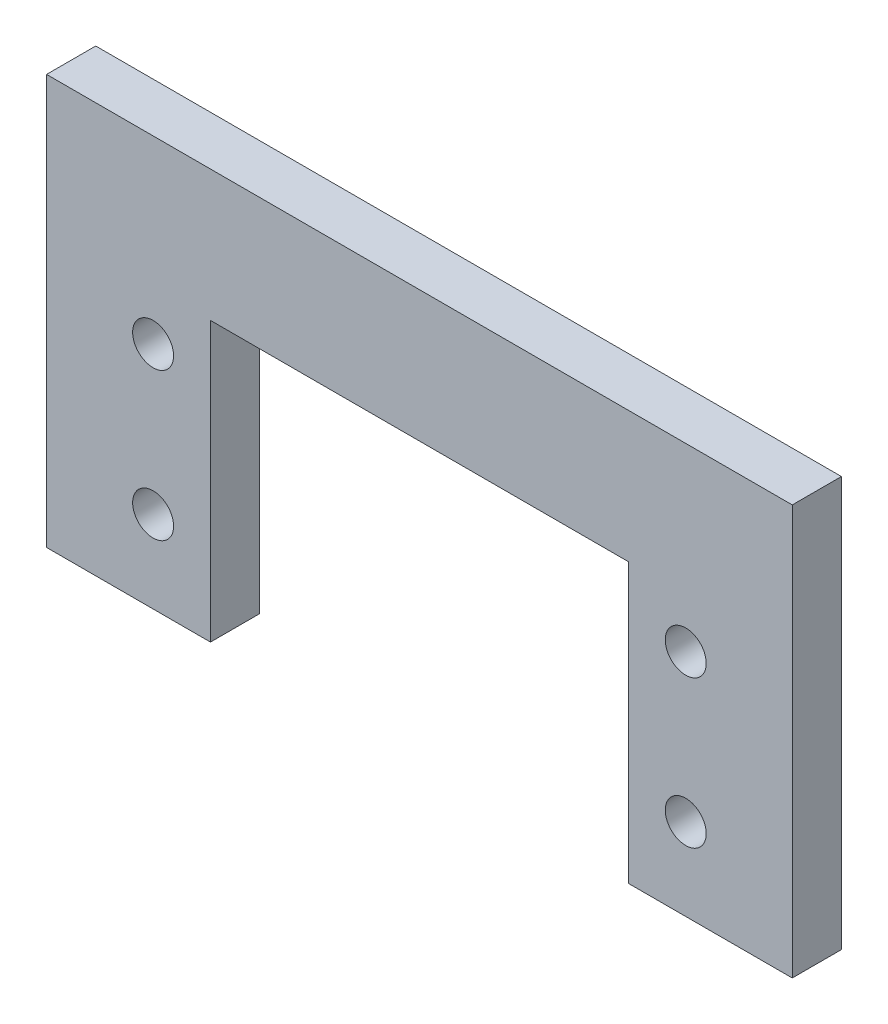
ISO-10303-21;
HEADER;
FILE_DESCRIPTION(('STEP AP214'),'2;1');
FILE_NAME('part.step','',(''),(''),'','','');
FILE_SCHEMA(('AUTOMOTIVE_DESIGN { 1 0 10303 214 1 1 1 1 }'));
ENDSEC;
DATA;
#1=APPLICATION_CONTEXT('core data for automotive mechanical design processes');
#2=APPLICATION_PROTOCOL_DEFINITION('international standard','automotive_design',2000,#1);
#3=PRODUCT_CONTEXT('',#1,'mechanical');
#4=PRODUCT('Part','Part','',(#3));
#5=PRODUCT_RELATED_PRODUCT_CATEGORY('part','',(#4));
#6=PRODUCT_DEFINITION_FORMATION('','',#4);
#7=PRODUCT_DEFINITION_CONTEXT('part definition',#1,'design');
#8=PRODUCT_DEFINITION('design','',#6,#7);
#9=PRODUCT_DEFINITION_SHAPE('','',#8);
#10=(LENGTH_UNIT() NAMED_UNIT(*) SI_UNIT(.MILLI.,.METRE.));
#11=(NAMED_UNIT(*) PLANE_ANGLE_UNIT() SI_UNIT($,.RADIAN.));
#12=(NAMED_UNIT(*) SI_UNIT($,.STERADIAN.) SOLID_ANGLE_UNIT());
#13=UNCERTAINTY_MEASURE_WITH_UNIT(LENGTH_MEASURE(1.E-05),#10,'distance_accuracy_value','');
#14=(GEOMETRIC_REPRESENTATION_CONTEXT(3) GLOBAL_UNCERTAINTY_ASSIGNED_CONTEXT((#13)) GLOBAL_UNIT_ASSIGNED_CONTEXT((#10,
#11,#12)) REPRESENTATION_CONTEXT('',''));
#15=CARTESIAN_POINT('',(0.,0.,0.));
#16=DIRECTION('',(0.,0.,1.));
#17=DIRECTION('',(1.,0.,0.));
#18=AXIS2_PLACEMENT_3D('',#15,#16,#17);
#19=CARTESIAN_POINT('',(0.,0.,3.));
#20=DIRECTION('',(0.,0.,1.));
#21=DIRECTION('',(1.,0.,0.));
#22=AXIS2_PLACEMENT_3D('',#19,#20,#21);
#23=PLANE('',#22);
#24=CARTESIAN_POINT('',(-16.25,-2.,3.));
#25=DIRECTION('',(0.,0.,1.));
#26=DIRECTION('',(1.,0.,0.));
#27=AXIS2_PLACEMENT_3D('',#24,#25,#26);
#28=CIRCLE('',#27,1.25);
#29=CARTESIAN_POINT('',(-15.,-2.,3.));
#30=VERTEX_POINT('',#29);
#31=EDGE_CURVE('E192',#30,#30,#28,.T.);
#32=ORIENTED_EDGE('',*,*,#31,.F.);
#33=EDGE_LOOP('',(#32));
#34=FACE_BOUND('',#33,.T.);
#35=CARTESIAN_POINT('',(-16.25,-11.,3.));
#36=DIRECTION('',(0.,0.,1.));
#37=DIRECTION('',(1.,0.,0.));
#38=AXIS2_PLACEMENT_3D('',#35,#36,#37);
#39=CIRCLE('',#38,1.25);
#40=CARTESIAN_POINT('',(-15.,-11.,3.));
#41=VERTEX_POINT('',#40);
#42=EDGE_CURVE('E142',#41,#41,#39,.T.);
#43=ORIENTED_EDGE('',*,*,#42,.F.);
#44=EDGE_LOOP('',(#43));
#45=FACE_BOUND('',#44,.T.);
#46=DIRECTION('',(0.,-1.,0.));
#47=VECTOR('',#46,1.);
#48=CARTESIAN_POINT('',(-22.75,9.,3.));
#49=LINE('',#48,#47);
#50=CARTESIAN_POINT('',(-22.75,9.,3.));
#51=VERTEX_POINT('',#50);
#52=CARTESIAN_POINT('',(-22.75,-16.,3.));
#53=VERTEX_POINT('',#52);
#54=EDGE_CURVE('E158',#51,#53,#49,.T.);
#55=ORIENTED_EDGE('',*,*,#54,.T.);
#56=DIRECTION('',(1.,0.,0.));
#57=VECTOR('',#56,1.);
#58=CARTESIAN_POINT('',(-22.75,-16.,3.));
#59=LINE('',#58,#57);
#60=CARTESIAN_POINT('',(-12.75,-16.,3.));
#61=VERTEX_POINT('',#60);
#62=EDGE_CURVE('E100',#53,#61,#59,.T.);
#63=ORIENTED_EDGE('',*,*,#62,.T.);
#64=DIRECTION('',(0.,-1.,0.));
#65=VECTOR('',#64,1.);
#66=CARTESIAN_POINT('',(-12.75,0.999999999999997,3.));
#67=LINE('',#66,#65);
#68=CARTESIAN_POINT('',(-12.75,0.999999999999997,3.));
#69=VERTEX_POINT('',#68);
#70=EDGE_CURVE('E170',#69,#61,#67,.T.);
#71=ORIENTED_EDGE('',*,*,#70,.F.);
#72=DIRECTION('',(-1.,0.,0.));
#73=VECTOR('',#72,1.);
#74=CARTESIAN_POINT('',(12.75,0.999999999999997,3.));
#75=LINE('',#74,#73);
#76=CARTESIAN_POINT('',(12.75,0.999999999999997,3.));
#77=VERTEX_POINT('',#76);
#78=EDGE_CURVE('E180',#77,#69,#75,.T.);
#79=ORIENTED_EDGE('',*,*,#78,.F.);
#80=DIRECTION('',(0.,-1.,0.));
#81=VECTOR('',#80,1.);
#82=CARTESIAN_POINT('',(12.75,0.999999999999997,3.));
#83=LINE('',#82,#81);
#84=CARTESIAN_POINT('',(12.75,-16.,3.));
#85=VERTEX_POINT('',#84);
#86=EDGE_CURVE('E131',#77,#85,#83,.T.);
#87=ORIENTED_EDGE('',*,*,#86,.T.);
#88=DIRECTION('',(-1.,0.,0.));
#89=VECTOR('',#88,1.);
#90=CARTESIAN_POINT('',(22.75,-16.,3.));
#91=LINE('',#90,#89);
#92=CARTESIAN_POINT('',(22.75,-16.,3.));
#93=VERTEX_POINT('',#92);
#94=EDGE_CURVE('E118',#93,#85,#91,.T.);
#95=ORIENTED_EDGE('',*,*,#94,.F.);
#96=DIRECTION('',(0.,-1.,0.));
#97=VECTOR('',#96,1.);
#98=CARTESIAN_POINT('',(22.75,9.,3.));
#99=LINE('',#98,#97);
#100=CARTESIAN_POINT('',(22.75,9.,3.));
#101=VERTEX_POINT('',#100);
#102=EDGE_CURVE('E128',#101,#93,#99,.T.);
#103=ORIENTED_EDGE('',*,*,#102,.F.);
#104=DIRECTION('',(-1.,0.,0.));
#105=VECTOR('',#104,1.);
#106=CARTESIAN_POINT('',(22.75,9.,3.));
#107=LINE('',#106,#105);
#108=EDGE_CURVE('E56',#101,#51,#107,.T.);
#109=ORIENTED_EDGE('',*,*,#108,.T.);
#110=EDGE_LOOP('',(#55,#63,#71,#79,#87,#95,#103,#109));
#111=FACE_BOUND('',#110,.T.);
#112=CARTESIAN_POINT('',(16.25,-2.,3.));
#113=DIRECTION('',(0.,0.,1.));
#114=DIRECTION('',(1.,0.,0.));
#115=AXIS2_PLACEMENT_3D('',#112,#113,#114);
#116=CIRCLE('',#115,1.25);
#117=CARTESIAN_POINT('',(17.5,-2.,3.));
#118=VERTEX_POINT('',#117);
#119=EDGE_CURVE('E204',#118,#118,#116,.F.);
#120=ORIENTED_EDGE('',*,*,#119,.T.);
#121=EDGE_LOOP('',(#120));
#122=FACE_BOUND('',#121,.T.);
#123=CARTESIAN_POINT('',(16.25,-11.,3.));
#124=DIRECTION('',(0.,0.,1.));
#125=DIRECTION('',(1.,0.,0.));
#126=AXIS2_PLACEMENT_3D('',#123,#124,#125);
#127=CIRCLE('',#126,1.25);
#128=CARTESIAN_POINT('',(17.5,-11.,3.));
#129=VERTEX_POINT('',#128);
#130=EDGE_CURVE('E198',#129,#129,#127,.F.);
#131=ORIENTED_EDGE('',*,*,#130,.T.);
#132=EDGE_LOOP('',(#131));
#133=FACE_BOUND('',#132,.T.);
#134=ADVANCED_FACE('F39',(#34,#45,#111,#122,#133),#23,.T.);
#135=CARTESIAN_POINT('',(0.,0.,0.));
#136=DIRECTION('',(0.,0.,1.));
#137=DIRECTION('',(1.,0.,0.));
#138=AXIS2_PLACEMENT_3D('',#135,#136,#137);
#139=PLANE('',#138);
#140=CARTESIAN_POINT('',(-16.25,-2.,0.));
#141=DIRECTION('',(0.,0.,1.));
#142=DIRECTION('',(1.,0.,0.));
#143=AXIS2_PLACEMENT_3D('',#140,#141,#142);
#144=CIRCLE('',#143,1.25);
#145=CARTESIAN_POINT('',(-15.,-2.,0.));
#146=VERTEX_POINT('',#145);
#147=EDGE_CURVE('E195',#146,#146,#144,.T.);
#148=ORIENTED_EDGE('',*,*,#147,.T.);
#149=EDGE_LOOP('',(#148));
#150=FACE_BOUND('',#149,.T.);
#151=CARTESIAN_POINT('',(16.25,-2.,0.));
#152=DIRECTION('',(0.,0.,1.));
#153=DIRECTION('',(1.,0.,0.));
#154=AXIS2_PLACEMENT_3D('',#151,#152,#153);
#155=CIRCLE('',#154,1.25);
#156=CARTESIAN_POINT('',(17.5,-2.,0.));
#157=VERTEX_POINT('',#156);
#158=EDGE_CURVE('E189',#157,#157,#155,.F.);
#159=ORIENTED_EDGE('',*,*,#158,.F.);
#160=EDGE_LOOP('',(#159));
#161=FACE_BOUND('',#160,.T.);
#162=CARTESIAN_POINT('',(-16.25,-11.,0.));
#163=DIRECTION('',(0.,0.,1.));
#164=DIRECTION('',(1.,0.,0.));
#165=AXIS2_PLACEMENT_3D('',#162,#163,#164);
#166=CIRCLE('',#165,1.25);
#167=CARTESIAN_POINT('',(-15.,-11.,0.));
#168=VERTEX_POINT('',#167);
#169=EDGE_CURVE('E186',#168,#168,#166,.T.);
#170=ORIENTED_EDGE('',*,*,#169,.T.);
#171=EDGE_LOOP('',(#170));
#172=FACE_BOUND('',#171,.T.);
#173=DIRECTION('',(0.,-1.,0.));
#174=VECTOR('',#173,1.);
#175=CARTESIAN_POINT('',(-22.75,9.,0.));
#176=LINE('',#175,#174);
#177=CARTESIAN_POINT('',(-22.75,9.,0.));
#178=VERTEX_POINT('',#177);
#179=CARTESIAN_POINT('',(-22.75,-16.,0.));
#180=VERTEX_POINT('',#179);
#181=EDGE_CURVE('E139',#178,#180,#176,.T.);
#182=ORIENTED_EDGE('',*,*,#181,.F.);
#183=DIRECTION('',(1.,0.,0.));
#184=VECTOR('',#183,1.);
#185=CARTESIAN_POINT('',(-22.75,9.,0.));
#186=LINE('',#185,#184);
#187=CARTESIAN_POINT('',(22.75,9.,0.));
#188=VERTEX_POINT('',#187);
#189=EDGE_CURVE('E86',#178,#188,#186,.T.);
#190=ORIENTED_EDGE('',*,*,#189,.T.);
#191=DIRECTION('',(0.,-1.,0.));
#192=VECTOR('',#191,1.);
#193=CARTESIAN_POINT('',(22.75,9.,0.));
#194=LINE('',#193,#192);
#195=CARTESIAN_POINT('',(22.75,-16.,0.));
#196=VERTEX_POINT('',#195);
#197=EDGE_CURVE('E155',#188,#196,#194,.T.);
#198=ORIENTED_EDGE('',*,*,#197,.T.);
#199=DIRECTION('',(-1.,0.,0.));
#200=VECTOR('',#199,1.);
#201=CARTESIAN_POINT('',(22.75,-16.,0.));
#202=LINE('',#201,#200);
#203=CARTESIAN_POINT('',(12.75,-16.,0.));
#204=VERTEX_POINT('',#203);
#205=EDGE_CURVE('E120',#196,#204,#202,.T.);
#206=ORIENTED_EDGE('',*,*,#205,.T.);
#207=DIRECTION('',(0.,-1.,0.));
#208=VECTOR('',#207,1.);
#209=CARTESIAN_POINT('',(12.75,0.999999999999997,0.));
#210=LINE('',#209,#208);
#211=CARTESIAN_POINT('',(12.75,0.999999999999997,0.));
#212=VERTEX_POINT('',#211);
#213=EDGE_CURVE('E151',#212,#204,#210,.T.);
#214=ORIENTED_EDGE('',*,*,#213,.F.);
#215=DIRECTION('',(-1.,0.,0.));
#216=VECTOR('',#215,1.);
#217=CARTESIAN_POINT('',(12.75,0.999999999999997,0.));
#218=LINE('',#217,#216);
#219=CARTESIAN_POINT('',(-12.75,0.999999999999997,0.));
#220=VERTEX_POINT('',#219);
#221=EDGE_CURVE('E148',#212,#220,#218,.T.);
#222=ORIENTED_EDGE('',*,*,#221,.T.);
#223=DIRECTION('',(0.,-1.,0.));
#224=VECTOR('',#223,1.);
#225=CARTESIAN_POINT('',(-12.75,0.999999999999997,0.));
#226=LINE('',#225,#224);
#227=CARTESIAN_POINT('',(-12.75,-16.,0.));
#228=VERTEX_POINT('',#227);
#229=EDGE_CURVE('E145',#220,#228,#226,.T.);
#230=ORIENTED_EDGE('',*,*,#229,.T.);
#231=DIRECTION('',(1.,0.,0.));
#232=VECTOR('',#231,1.);
#233=CARTESIAN_POINT('',(-22.75,-16.,0.));
#234=LINE('',#233,#232);
#235=EDGE_CURVE('E141',#180,#228,#234,.T.);
#236=ORIENTED_EDGE('',*,*,#235,.F.);
#237=EDGE_LOOP('',(#182,#190,#198,#206,#214,#222,#230,#236));
#238=FACE_BOUND('',#237,.T.);
#239=CARTESIAN_POINT('',(16.25,-11.,0.));
#240=DIRECTION('',(0.,0.,1.));
#241=DIRECTION('',(1.,0.,0.));
#242=AXIS2_PLACEMENT_3D('',#239,#240,#241);
#243=CIRCLE('',#242,1.25);
#244=CARTESIAN_POINT('',(17.5,-11.,0.));
#245=VERTEX_POINT('',#244);
#246=EDGE_CURVE('E201',#245,#245,#243,.F.);
#247=ORIENTED_EDGE('',*,*,#246,.F.);
#248=EDGE_LOOP('',(#247));
#249=FACE_BOUND('',#248,.T.);
#250=ADVANCED_FACE('F173',(#150,#161,#172,#238,#249),#139,.F.);
#251=CARTESIAN_POINT('',(-22.75,9.,3.));
#252=DIRECTION('',(1.,0.,0.));
#253=DIRECTION('',(0.,1.,0.));
#254=AXIS2_PLACEMENT_3D('',#251,#252,#253);
#255=PLANE('',#254);
#256=ORIENTED_EDGE('',*,*,#181,.T.);
#257=DIRECTION('',(0.,0.,-1.));
#258=VECTOR('',#257,1.);
#259=CARTESIAN_POINT('',(-22.75,-16.,3.));
#260=LINE('',#259,#258);
#261=EDGE_CURVE('E11',#53,#180,#260,.T.);
#262=ORIENTED_EDGE('',*,*,#261,.F.);
#263=ORIENTED_EDGE('',*,*,#54,.F.);
#264=DIRECTION('',(0.,0.,-1.));
#265=VECTOR('',#264,1.);
#266=CARTESIAN_POINT('',(-22.75,9.,3.));
#267=LINE('',#266,#265);
#268=EDGE_CURVE('E93',#51,#178,#267,.T.);
#269=ORIENTED_EDGE('',*,*,#268,.T.);
#270=EDGE_LOOP('',(#256,#262,#263,#269));
#271=FACE_BOUND('',#270,.T.);
#272=ADVANCED_FACE('F41',(#271),#255,.F.);
#273=CARTESIAN_POINT('',(-22.75,-16.,3.));
#274=DIRECTION('',(0.,1.,0.));
#275=DIRECTION('',(0.,0.,1.));
#276=AXIS2_PLACEMENT_3D('',#273,#274,#275);
#277=PLANE('',#276);
#278=ORIENTED_EDGE('',*,*,#235,.T.);
#279=DIRECTION('',(0.,0.,-1.));
#280=VECTOR('',#279,1.);
#281=CARTESIAN_POINT('',(-12.75,-16.,3.));
#282=LINE('',#281,#280);
#283=EDGE_CURVE('E48',#61,#228,#282,.T.);
#284=ORIENTED_EDGE('',*,*,#283,.F.);
#285=ORIENTED_EDGE('',*,*,#62,.F.);
#286=ORIENTED_EDGE('',*,*,#261,.T.);
#287=EDGE_LOOP('',(#278,#284,#285,#286));
#288=FACE_BOUND('',#287,.T.);
#289=ADVANCED_FACE('F171',(#288),#277,.F.);
#290=CARTESIAN_POINT('',(-12.75,0.999999999999997,3.));
#291=DIRECTION('',(1.,0.,0.));
#292=DIRECTION('',(0.,1.,0.));
#293=AXIS2_PLACEMENT_3D('',#290,#291,#292);
#294=PLANE('',#293);
#295=ORIENTED_EDGE('',*,*,#229,.F.);
#296=DIRECTION('',(0.,0.,-1.));
#297=VECTOR('',#296,1.);
#298=CARTESIAN_POINT('',(-12.75,0.999999999999997,3.));
#299=LINE('',#298,#297);
#300=EDGE_CURVE('E164',#69,#220,#299,.T.);
#301=ORIENTED_EDGE('',*,*,#300,.F.);
#302=ORIENTED_EDGE('',*,*,#70,.T.);
#303=ORIENTED_EDGE('',*,*,#283,.T.);
#304=EDGE_LOOP('',(#295,#301,#302,#303));
#305=FACE_BOUND('',#304,.T.);
#306=ADVANCED_FACE('F168',(#305),#294,.T.);
#307=CARTESIAN_POINT('',(12.75,0.999999999999997,3.));
#308=DIRECTION('',(0.,-1.,0.));
#309=DIRECTION('',(0.,0.,-1.));
#310=AXIS2_PLACEMENT_3D('',#307,#308,#309);
#311=PLANE('',#310);
#312=ORIENTED_EDGE('',*,*,#221,.F.);
#313=DIRECTION('',(0.,0.,-1.));
#314=VECTOR('',#313,1.);
#315=CARTESIAN_POINT('',(12.75,0.999999999999997,3.));
#316=LINE('',#315,#314);
#317=EDGE_CURVE('E162',#77,#212,#316,.T.);
#318=ORIENTED_EDGE('',*,*,#317,.F.);
#319=ORIENTED_EDGE('',*,*,#78,.T.);
#320=ORIENTED_EDGE('',*,*,#300,.T.);
#321=EDGE_LOOP('',(#312,#318,#319,#320));
#322=FACE_BOUND('',#321,.T.);
#323=ADVANCED_FACE('F178',(#322),#311,.T.);
#324=CARTESIAN_POINT('',(12.75,0.999999999999997,3.));
#325=DIRECTION('',(1.,0.,0.));
#326=DIRECTION('',(0.,1.,0.));
#327=AXIS2_PLACEMENT_3D('',#324,#325,#326);
#328=PLANE('',#327);
#329=ORIENTED_EDGE('',*,*,#213,.T.);
#330=DIRECTION('',(0.,0.,-1.));
#331=VECTOR('',#330,1.);
#332=CARTESIAN_POINT('',(12.75,-16.,3.));
#333=LINE('',#332,#331);
#334=EDGE_CURVE('E124',#85,#204,#333,.T.);
#335=ORIENTED_EDGE('',*,*,#334,.F.);
#336=ORIENTED_EDGE('',*,*,#86,.F.);
#337=ORIENTED_EDGE('',*,*,#317,.T.);
#338=EDGE_LOOP('',(#329,#335,#336,#337));
#339=FACE_BOUND('',#338,.T.);
#340=ADVANCED_FACE('F245',(#339),#328,.F.);
#341=CARTESIAN_POINT('',(22.75,-16.,3.));
#342=DIRECTION('',(0.,-1.,0.));
#343=DIRECTION('',(0.,0.,-1.));
#344=AXIS2_PLACEMENT_3D('',#341,#342,#343);
#345=PLANE('',#344);
#346=ORIENTED_EDGE('',*,*,#205,.F.);
#347=DIRECTION('',(0.,0.,-1.));
#348=VECTOR('',#347,1.);
#349=CARTESIAN_POINT('',(22.75,-16.,3.));
#350=LINE('',#349,#348);
#351=EDGE_CURVE('E115',#93,#196,#350,.T.);
#352=ORIENTED_EDGE('',*,*,#351,.F.);
#353=ORIENTED_EDGE('',*,*,#94,.T.);
#354=ORIENTED_EDGE('',*,*,#334,.T.);
#355=EDGE_LOOP('',(#346,#352,#353,#354));
#356=FACE_BOUND('',#355,.T.);
#357=ADVANCED_FACE('F117',(#356),#345,.T.);
#358=CARTESIAN_POINT('',(22.75,9.,3.));
#359=DIRECTION('',(1.,0.,0.));
#360=DIRECTION('',(0.,1.,0.));
#361=AXIS2_PLACEMENT_3D('',#358,#359,#360);
#362=PLANE('',#361);
#363=ORIENTED_EDGE('',*,*,#197,.F.);
#364=DIRECTION('',(0.,0.,-1.));
#365=VECTOR('',#364,1.);
#366=CARTESIAN_POINT('',(22.75,9.,3.));
#367=LINE('',#366,#365);
#368=EDGE_CURVE('E125',#101,#188,#367,.T.);
#369=ORIENTED_EDGE('',*,*,#368,.F.);
#370=ORIENTED_EDGE('',*,*,#102,.T.);
#371=ORIENTED_EDGE('',*,*,#351,.T.);
#372=EDGE_LOOP('',(#363,#369,#370,#371));
#373=FACE_BOUND('',#372,.T.);
#374=ADVANCED_FACE('F134',(#373),#362,.T.);
#375=CARTESIAN_POINT('',(-22.75,9.,3.));
#376=DIRECTION('',(0.,1.,0.));
#377=DIRECTION('',(-1.,0.,0.));
#378=AXIS2_PLACEMENT_3D('',#375,#376,#377);
#379=PLANE('',#378);
#380=ORIENTED_EDGE('',*,*,#189,.F.);
#381=ORIENTED_EDGE('',*,*,#268,.F.);
#382=ORIENTED_EDGE('',*,*,#108,.F.);
#383=ORIENTED_EDGE('',*,*,#368,.T.);
#384=EDGE_LOOP('',(#380,#381,#382,#383));
#385=FACE_BOUND('',#384,.T.);
#386=ADVANCED_FACE('F220',(#385),#379,.T.);
#387=CARTESIAN_POINT('',(-16.25,-11.,3.));
#388=DIRECTION('',(0.,0.,-1.));
#389=DIRECTION('',(-1.,0.,0.));
#390=AXIS2_PLACEMENT_3D('',#387,#388,#389);
#391=CYLINDRICAL_SURFACE('',#390,1.25);
#392=ORIENTED_EDGE('',*,*,#42,.T.);
#393=EDGE_LOOP('',(#392));
#394=FACE_BOUND('',#393,.T.);
#395=ORIENTED_EDGE('',*,*,#169,.F.);
#396=EDGE_LOOP('',(#395));
#397=FACE_BOUND('',#396,.T.);
#398=ADVANCED_FACE('F218',(#394,#397),#391,.F.);
#399=CARTESIAN_POINT('',(16.25,-2.,3.));
#400=DIRECTION('',(0.,0.,-1.));
#401=DIRECTION('',(-1.,0.,0.));
#402=AXIS2_PLACEMENT_3D('',#399,#400,#401);
#403=CYLINDRICAL_SURFACE('',#402,1.25);
#404=ORIENTED_EDGE('',*,*,#119,.F.);
#405=EDGE_LOOP('',(#404));
#406=FACE_BOUND('',#405,.T.);
#407=ORIENTED_EDGE('',*,*,#158,.T.);
#408=EDGE_LOOP('',(#407));
#409=FACE_BOUND('',#408,.T.);
#410=ADVANCED_FACE('F210',(#406,#409),#403,.F.);
#411=CARTESIAN_POINT('',(16.25,-11.,3.));
#412=DIRECTION('',(0.,0.,-1.));
#413=DIRECTION('',(-1.,0.,0.));
#414=AXIS2_PLACEMENT_3D('',#411,#412,#413);
#415=CYLINDRICAL_SURFACE('',#414,1.25);
#416=ORIENTED_EDGE('',*,*,#130,.F.);
#417=EDGE_LOOP('',(#416));
#418=FACE_BOUND('',#417,.T.);
#419=ORIENTED_EDGE('',*,*,#246,.T.);
#420=EDGE_LOOP('',(#419));
#421=FACE_BOUND('',#420,.T.);
#422=ADVANCED_FACE('F226',(#418,#421),#415,.F.);
#423=CARTESIAN_POINT('',(-16.25,-2.,3.));
#424=DIRECTION('',(0.,0.,-1.));
#425=DIRECTION('',(-1.,0.,0.));
#426=AXIS2_PLACEMENT_3D('',#423,#424,#425);
#427=CYLINDRICAL_SURFACE('',#426,1.25);
#428=ORIENTED_EDGE('',*,*,#31,.T.);
#429=EDGE_LOOP('',(#428));
#430=FACE_BOUND('',#429,.T.);
#431=ORIENTED_EDGE('',*,*,#147,.F.);
#432=EDGE_LOOP('',(#431));
#433=FACE_BOUND('',#432,.T.);
#434=ADVANCED_FACE('F334',(#430,#433),#427,.F.);
#435=CLOSED_SHELL('',(#134,#250,#272,#289,#306,#323,#340,#357,#374,#386,#398,#410,#422,#434));
#436=MANIFOLD_SOLID_BREP('B2',#435);
#437=ADVANCED_BREP_SHAPE_REPRESENTATION('',(#18,#436),#14);
#438=SHAPE_DEFINITION_REPRESENTATION(#9,#437);
ENDSEC;
END-ISO-10303-21;
